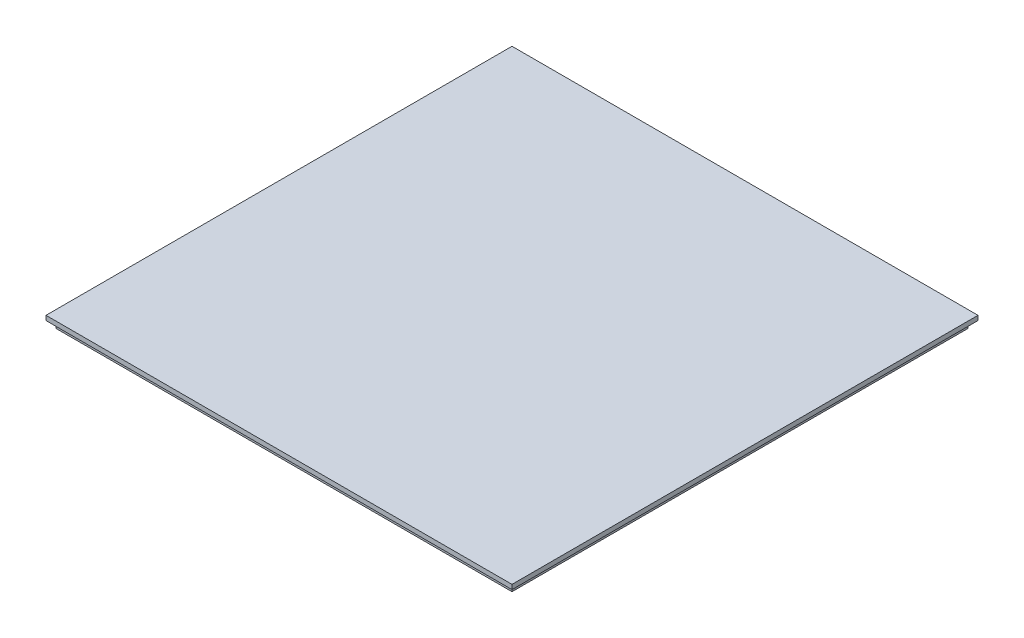
ISO-10303-21;
HEADER;
FILE_DESCRIPTION(('STEP AP214'),'2;1');
FILE_NAME('part.step','',(''),(''),'','','');
FILE_SCHEMA(('AUTOMOTIVE_DESIGN { 1 0 10303 214 1 1 1 1 }'));
ENDSEC;
DATA;
#1=APPLICATION_CONTEXT('core data for automotive mechanical design processes');
#2=APPLICATION_PROTOCOL_DEFINITION('international standard','automotive_design',2000,#1);
#3=PRODUCT_CONTEXT('',#1,'mechanical');
#4=PRODUCT('Part','Part','',(#3));
#5=PRODUCT_RELATED_PRODUCT_CATEGORY('part','',(#4));
#6=PRODUCT_DEFINITION_FORMATION('','',#4);
#7=PRODUCT_DEFINITION_CONTEXT('part definition',#1,'design');
#8=PRODUCT_DEFINITION('design','',#6,#7);
#9=PRODUCT_DEFINITION_SHAPE('','',#8);
#10=(LENGTH_UNIT() NAMED_UNIT(*) SI_UNIT(.MILLI.,.METRE.));
#11=(NAMED_UNIT(*) PLANE_ANGLE_UNIT() SI_UNIT($,.RADIAN.));
#12=(NAMED_UNIT(*) SI_UNIT($,.STERADIAN.) SOLID_ANGLE_UNIT());
#13=UNCERTAINTY_MEASURE_WITH_UNIT(LENGTH_MEASURE(1.E-05),#10,'distance_accuracy_value','');
#14=(GEOMETRIC_REPRESENTATION_CONTEXT(3) GLOBAL_UNCERTAINTY_ASSIGNED_CONTEXT((#13)) GLOBAL_UNIT_ASSIGNED_CONTEXT((#10,
#11,#12)) REPRESENTATION_CONTEXT('',''));
#15=CARTESIAN_POINT('',(0.,0.,0.));
#16=DIRECTION('',(0.,0.,1.));
#17=DIRECTION('',(1.,0.,0.));
#18=AXIS2_PLACEMENT_3D('',#15,#16,#17);
#19=CARTESIAN_POINT('',(-49.9,29.5,-49.9));
#20=DIRECTION('',(-1.,0.,0.));
#21=DIRECTION('',(0.,0.,1.));
#22=AXIS2_PLACEMENT_3D('',#19,#20,#21);
#23=PLANE('',#22);
#24=DIRECTION('',(0.,0.,1.));
#25=VECTOR('',#24,1.);
#26=CARTESIAN_POINT('',(-49.9,31.,-49.9));
#27=LINE('',#26,#25);
#28=CARTESIAN_POINT('',(-49.9,31.,-49.9));
#29=VERTEX_POINT('',#28);
#30=CARTESIAN_POINT('',(-49.9,31.,49.9));
#31=VERTEX_POINT('',#30);
#32=EDGE_CURVE('E134',#29,#31,#27,.T.);
#33=ORIENTED_EDGE('',*,*,#32,.F.);
#34=DIRECTION('',(0.,1.,0.));
#35=VECTOR('',#34,1.);
#36=CARTESIAN_POINT('',(-49.9,29.5,-49.9));
#37=LINE('',#36,#35);
#38=CARTESIAN_POINT('',(-49.9,29.5,-49.9));
#39=VERTEX_POINT('',#38);
#40=EDGE_CURVE('E11',#39,#29,#37,.T.);
#41=ORIENTED_EDGE('',*,*,#40,.F.);
#42=DIRECTION('',(0.,0.,1.));
#43=VECTOR('',#42,1.);
#44=CARTESIAN_POINT('',(-49.9,29.5,-49.9));
#45=LINE('',#44,#43);
#46=CARTESIAN_POINT('',(-49.9,29.5,49.9));
#47=VERTEX_POINT('',#46);
#48=EDGE_CURVE('E143',#39,#47,#45,.T.);
#49=ORIENTED_EDGE('',*,*,#48,.T.);
#50=DIRECTION('',(0.,1.,0.));
#51=VECTOR('',#50,1.);
#52=CARTESIAN_POINT('',(-49.9,29.5,49.9));
#53=LINE('',#52,#51);
#54=EDGE_CURVE('E42',#47,#31,#53,.T.);
#55=ORIENTED_EDGE('',*,*,#54,.T.);
#56=EDGE_LOOP('',(#33,#41,#49,#55));
#57=FACE_BOUND('',#56,.T.);
#58=ADVANCED_FACE('F39',(#57),#23,.T.);
#59=CARTESIAN_POINT('',(49.9,29.5,-49.9));
#60=DIRECTION('',(0.,0.,-1.));
#61=DIRECTION('',(-1.,0.,0.));
#62=AXIS2_PLACEMENT_3D('',#59,#60,#61);
#63=PLANE('',#62);
#64=DIRECTION('',(-1.,0.,0.));
#65=VECTOR('',#64,1.);
#66=CARTESIAN_POINT('',(49.9,31.,-49.9));
#67=LINE('',#66,#65);
#68=CARTESIAN_POINT('',(49.9,31.,-49.9));
#69=VERTEX_POINT('',#68);
#70=EDGE_CURVE('E146',#69,#29,#67,.T.);
#71=ORIENTED_EDGE('',*,*,#70,.F.);
#72=DIRECTION('',(0.,1.,0.));
#73=VECTOR('',#72,1.);
#74=CARTESIAN_POINT('',(49.9,29.5,-49.9));
#75=LINE('',#74,#73);
#76=CARTESIAN_POINT('',(49.9,29.5,-49.9));
#77=VERTEX_POINT('',#76);
#78=EDGE_CURVE('E48',#77,#69,#75,.T.);
#79=ORIENTED_EDGE('',*,*,#78,.F.);
#80=DIRECTION('',(-1.,0.,0.));
#81=VECTOR('',#80,1.);
#82=CARTESIAN_POINT('',(49.9,29.5,-49.9));
#83=LINE('',#82,#81);
#84=EDGE_CURVE('E150',#77,#39,#83,.T.);
#85=ORIENTED_EDGE('',*,*,#84,.T.);
#86=ORIENTED_EDGE('',*,*,#40,.T.);
#87=EDGE_LOOP('',(#71,#79,#85,#86));
#88=FACE_BOUND('',#87,.T.);
#89=ADVANCED_FACE('F164',(#88),#63,.T.);
#90=CARTESIAN_POINT('',(49.9,29.5,49.9));
#91=DIRECTION('',(1.,0.,0.));
#92=DIRECTION('',(0.,0.,-1.));
#93=AXIS2_PLACEMENT_3D('',#90,#91,#92);
#94=PLANE('',#93);
#95=DIRECTION('',(0.,0.,-1.));
#96=VECTOR('',#95,1.);
#97=CARTESIAN_POINT('',(49.9,31.,49.9));
#98=LINE('',#97,#96);
#99=CARTESIAN_POINT('',(49.9,31.,49.9));
#100=VERTEX_POINT('',#99);
#101=EDGE_CURVE('E155',#100,#69,#98,.T.);
#102=ORIENTED_EDGE('',*,*,#101,.F.);
#103=DIRECTION('',(0.,1.,0.));
#104=VECTOR('',#103,1.);
#105=CARTESIAN_POINT('',(49.9,29.5,49.9));
#106=LINE('',#105,#104);
#107=CARTESIAN_POINT('',(49.9,29.5,49.9));
#108=VERTEX_POINT('',#107);
#109=EDGE_CURVE('E71',#108,#100,#106,.T.);
#110=ORIENTED_EDGE('',*,*,#109,.F.);
#111=DIRECTION('',(0.,0.,-1.));
#112=VECTOR('',#111,1.);
#113=CARTESIAN_POINT('',(49.9,29.5,49.9));
#114=LINE('',#113,#112);
#115=EDGE_CURVE('E148',#108,#77,#114,.T.);
#116=ORIENTED_EDGE('',*,*,#115,.T.);
#117=ORIENTED_EDGE('',*,*,#78,.T.);
#118=EDGE_LOOP('',(#102,#110,#116,#117));
#119=FACE_BOUND('',#118,.T.);
#120=ADVANCED_FACE('F169',(#119),#94,.T.);
#121=CARTESIAN_POINT('',(-49.9,29.5,49.9));
#122=DIRECTION('',(0.,0.,1.));
#123=DIRECTION('',(1.,0.,0.));
#124=AXIS2_PLACEMENT_3D('',#121,#122,#123);
#125=PLANE('',#124);
#126=DIRECTION('',(1.,0.,0.));
#127=VECTOR('',#126,1.);
#128=CARTESIAN_POINT('',(-49.9,31.,49.9));
#129=LINE('',#128,#127);
#130=EDGE_CURVE('E137',#31,#100,#129,.T.);
#131=ORIENTED_EDGE('',*,*,#130,.F.);
#132=ORIENTED_EDGE('',*,*,#54,.F.);
#133=DIRECTION('',(1.,0.,0.));
#134=VECTOR('',#133,1.);
#135=CARTESIAN_POINT('',(-49.9,29.5,49.9));
#136=LINE('',#135,#134);
#137=EDGE_CURVE('E145',#47,#108,#136,.T.);
#138=ORIENTED_EDGE('',*,*,#137,.T.);
#139=ORIENTED_EDGE('',*,*,#109,.T.);
#140=EDGE_LOOP('',(#131,#132,#138,#139));
#141=FACE_BOUND('',#140,.T.);
#142=ADVANCED_FACE('F160',(#141),#125,.T.);
#143=CARTESIAN_POINT('',(0.,29.5,0.));
#144=DIRECTION('',(0.,1.,0.));
#145=DIRECTION('',(0.,0.,1.));
#146=AXIS2_PLACEMENT_3D('',#143,#144,#145);
#147=PLANE('',#146);
#148=ORIENTED_EDGE('',*,*,#48,.F.);
#149=ORIENTED_EDGE('',*,*,#84,.F.);
#150=ORIENTED_EDGE('',*,*,#115,.F.);
#151=ORIENTED_EDGE('',*,*,#137,.F.);
#152=EDGE_LOOP('',(#148,#149,#150,#151));
#153=FACE_BOUND('',#152,.T.);
#154=ADVANCED_FACE('F168',(#153),#147,.F.);
#155=CARTESIAN_POINT('',(0.,31.,0.));
#156=DIRECTION('',(0.,1.,0.));
#157=DIRECTION('',(0.,0.,1.));
#158=AXIS2_PLACEMENT_3D('',#155,#156,#157);
#159=PLANE('',#158);
#160=DIRECTION('',(0.,0.,1.));
#161=VECTOR('',#160,1.);
#162=CARTESIAN_POINT('',(-51.,31.,-51.));
#163=LINE('',#162,#161);
#164=CARTESIAN_POINT('',(-51.,31.,-51.));
#165=VERTEX_POINT('',#164);
#166=CARTESIAN_POINT('',(-51.,31.,51.));
#167=VERTEX_POINT('',#166);
#168=EDGE_CURVE('E133',#165,#167,#163,.T.);
#169=ORIENTED_EDGE('',*,*,#168,.F.);
#170=DIRECTION('',(-1.,0.,0.));
#171=VECTOR('',#170,1.);
#172=CARTESIAN_POINT('',(-51.,31.,-51.));
#173=LINE('',#172,#171);
#174=CARTESIAN_POINT('',(51.,31.,-51.));
#175=VERTEX_POINT('',#174);
#176=EDGE_CURVE('E129',#175,#165,#173,.T.);
#177=ORIENTED_EDGE('',*,*,#176,.F.);
#178=DIRECTION('',(0.,0.,-1.));
#179=VECTOR('',#178,1.);
#180=CARTESIAN_POINT('',(51.,31.,-51.));
#181=LINE('',#180,#179);
#182=CARTESIAN_POINT('',(51.,31.,51.));
#183=VERTEX_POINT('',#182);
#184=EDGE_CURVE('E266',#183,#175,#181,.T.);
#185=ORIENTED_EDGE('',*,*,#184,.F.);
#186=DIRECTION('',(1.,0.,0.));
#187=VECTOR('',#186,1.);
#188=CARTESIAN_POINT('',(-51.,31.,51.));
#189=LINE('',#188,#187);
#190=EDGE_CURVE('E269',#167,#183,#189,.T.);
#191=ORIENTED_EDGE('',*,*,#190,.F.);
#192=EDGE_LOOP('',(#169,#177,#185,#191));
#193=FACE_BOUND('',#192,.T.);
#194=ORIENTED_EDGE('',*,*,#70,.T.);
#195=ORIENTED_EDGE('',*,*,#32,.T.);
#196=ORIENTED_EDGE('',*,*,#130,.T.);
#197=ORIENTED_EDGE('',*,*,#101,.T.);
#198=EDGE_LOOP('',(#194,#195,#196,#197));
#199=FACE_BOUND('',#198,.T.);
#200=ADVANCED_FACE('F162',(#193,#199),#159,.F.);
#201=CARTESIAN_POINT('',(-51.,32.,-51.));
#202=DIRECTION('',(1.,0.,0.));
#203=DIRECTION('',(0.,0.,-1.));
#204=AXIS2_PLACEMENT_3D('',#201,#202,#203);
#205=PLANE('',#204);
#206=ORIENTED_EDGE('',*,*,#168,.T.);
#207=DIRECTION('',(0.,-1.,0.));
#208=VECTOR('',#207,1.);
#209=CARTESIAN_POINT('',(-51.,32.,51.));
#210=LINE('',#209,#208);
#211=CARTESIAN_POINT('',(-51.,32.,51.));
#212=VERTEX_POINT('',#211);
#213=EDGE_CURVE('E113',#212,#167,#210,.T.);
#214=ORIENTED_EDGE('',*,*,#213,.F.);
#215=DIRECTION('',(0.,0.,1.));
#216=VECTOR('',#215,1.);
#217=CARTESIAN_POINT('',(-51.,32.,-51.));
#218=LINE('',#217,#216);
#219=CARTESIAN_POINT('',(-51.,32.,-51.));
#220=VERTEX_POINT('',#219);
#221=EDGE_CURVE('E120',#220,#212,#218,.T.);
#222=ORIENTED_EDGE('',*,*,#221,.F.);
#223=DIRECTION('',(0.,-1.,0.));
#224=VECTOR('',#223,1.);
#225=CARTESIAN_POINT('',(-51.,32.,-51.));
#226=LINE('',#225,#224);
#227=EDGE_CURVE('E263',#220,#165,#226,.T.);
#228=ORIENTED_EDGE('',*,*,#227,.T.);
#229=EDGE_LOOP('',(#206,#214,#222,#228));
#230=FACE_BOUND('',#229,.T.);
#231=ADVANCED_FACE('F131',(#230),#205,.F.);
#232=CARTESIAN_POINT('',(-51.,32.,51.));
#233=DIRECTION('',(0.,0.,-1.));
#234=DIRECTION('',(-1.,0.,0.));
#235=AXIS2_PLACEMENT_3D('',#232,#233,#234);
#236=PLANE('',#235);
#237=ORIENTED_EDGE('',*,*,#190,.T.);
#238=DIRECTION('',(0.,-1.,0.));
#239=VECTOR('',#238,1.);
#240=CARTESIAN_POINT('',(51.,32.,51.));
#241=LINE('',#240,#239);
#242=CARTESIAN_POINT('',(51.,32.,51.));
#243=VERTEX_POINT('',#242);
#244=EDGE_CURVE('E116',#243,#183,#241,.T.);
#245=ORIENTED_EDGE('',*,*,#244,.F.);
#246=DIRECTION('',(1.,0.,0.));
#247=VECTOR('',#246,1.);
#248=CARTESIAN_POINT('',(-51.,32.,51.));
#249=LINE('',#248,#247);
#250=EDGE_CURVE('E109',#212,#243,#249,.T.);
#251=ORIENTED_EDGE('',*,*,#250,.F.);
#252=ORIENTED_EDGE('',*,*,#213,.T.);
#253=EDGE_LOOP('',(#237,#245,#251,#252));
#254=FACE_BOUND('',#253,.T.);
#255=ADVANCED_FACE('F111',(#254),#236,.F.);
#256=CARTESIAN_POINT('',(51.,32.,-51.));
#257=DIRECTION('',(-1.,0.,0.));
#258=DIRECTION('',(0.,0.,1.));
#259=AXIS2_PLACEMENT_3D('',#256,#257,#258);
#260=PLANE('',#259);
#261=ORIENTED_EDGE('',*,*,#184,.T.);
#262=DIRECTION('',(0.,-1.,0.));
#263=VECTOR('',#262,1.);
#264=CARTESIAN_POINT('',(51.,32.,-51.));
#265=LINE('',#264,#263);
#266=CARTESIAN_POINT('',(51.,32.,-51.));
#267=VERTEX_POINT('',#266);
#268=EDGE_CURVE('E139',#267,#175,#265,.T.);
#269=ORIENTED_EDGE('',*,*,#268,.F.);
#270=DIRECTION('',(0.,0.,-1.));
#271=VECTOR('',#270,1.);
#272=CARTESIAN_POINT('',(51.,32.,-51.));
#273=LINE('',#272,#271);
#274=EDGE_CURVE('E119',#243,#267,#273,.T.);
#275=ORIENTED_EDGE('',*,*,#274,.F.);
#276=ORIENTED_EDGE('',*,*,#244,.T.);
#277=EDGE_LOOP('',(#261,#269,#275,#276));
#278=FACE_BOUND('',#277,.T.);
#279=ADVANCED_FACE('F226',(#278),#260,.F.);
#280=CARTESIAN_POINT('',(-51.,32.,-51.));
#281=DIRECTION('',(0.,0.,1.));
#282=DIRECTION('',(1.,0.,0.));
#283=AXIS2_PLACEMENT_3D('',#280,#281,#282);
#284=PLANE('',#283);
#285=ORIENTED_EDGE('',*,*,#176,.T.);
#286=ORIENTED_EDGE('',*,*,#227,.F.);
#287=DIRECTION('',(-1.,0.,0.));
#288=VECTOR('',#287,1.);
#289=CARTESIAN_POINT('',(-51.,32.,-51.));
#290=LINE('',#289,#288);
#291=EDGE_CURVE('E125',#267,#220,#290,.T.);
#292=ORIENTED_EDGE('',*,*,#291,.F.);
#293=ORIENTED_EDGE('',*,*,#268,.T.);
#294=EDGE_LOOP('',(#285,#286,#292,#293));
#295=FACE_BOUND('',#294,.T.);
#296=ADVANCED_FACE('F234',(#295),#284,.F.);
#297=CARTESIAN_POINT('',(0.,32.,0.));
#298=DIRECTION('',(0.,1.,0.));
#299=DIRECTION('',(0.,0.,1.));
#300=AXIS2_PLACEMENT_3D('',#297,#298,#299);
#301=PLANE('',#300);
#302=ORIENTED_EDGE('',*,*,#221,.T.);
#303=ORIENTED_EDGE('',*,*,#250,.T.);
#304=ORIENTED_EDGE('',*,*,#274,.T.);
#305=ORIENTED_EDGE('',*,*,#291,.T.);
#306=EDGE_LOOP('',(#302,#303,#304,#305));
#307=FACE_BOUND('',#306,.T.);
#308=ADVANCED_FACE('F123',(#307),#301,.T.);
#309=CLOSED_SHELL('',(#58,#89,#120,#142,#154,#200,#231,#255,#279,#296,#308));
#310=MANIFOLD_SOLID_BREP('B2',#309);
#311=ADVANCED_BREP_SHAPE_REPRESENTATION('',(#18,#310),#14);
#312=SHAPE_DEFINITION_REPRESENTATION(#9,#311);
ENDSEC;
END-ISO-10303-21;
